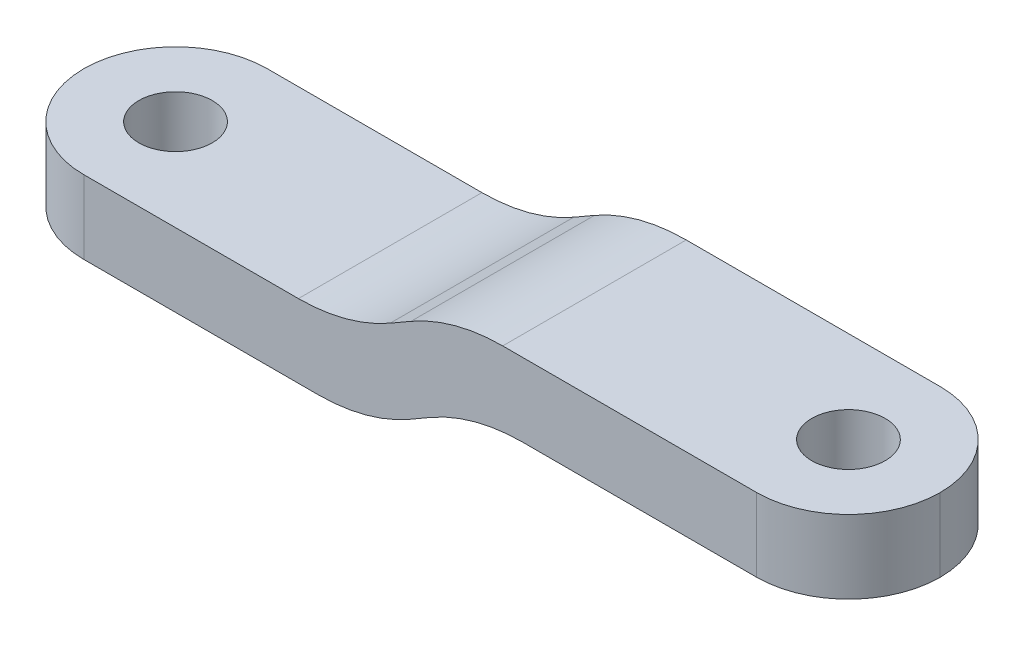
ISO-10303-21;
HEADER;
FILE_DESCRIPTION(('STEP AP214'),'2;1');
FILE_NAME('part.step','',(''),(''),'','','');
FILE_SCHEMA(('AUTOMOTIVE_DESIGN { 1 0 10303 214 1 1 1 1 }'));
ENDSEC;
DATA;
#1=APPLICATION_CONTEXT('core data for automotive mechanical design processes');
#2=APPLICATION_PROTOCOL_DEFINITION('international standard','automotive_design',2000,#1);
#3=PRODUCT_CONTEXT('',#1,'mechanical');
#4=PRODUCT('Part','Part','',(#3));
#5=PRODUCT_RELATED_PRODUCT_CATEGORY('part','',(#4));
#6=PRODUCT_DEFINITION_FORMATION('','',#4);
#7=PRODUCT_DEFINITION_CONTEXT('part definition',#1,'design');
#8=PRODUCT_DEFINITION('design','',#6,#7);
#9=PRODUCT_DEFINITION_SHAPE('','',#8);
#10=(LENGTH_UNIT() NAMED_UNIT(*) SI_UNIT(.MILLI.,.METRE.));
#11=(NAMED_UNIT(*) PLANE_ANGLE_UNIT() SI_UNIT($,.RADIAN.));
#12=(NAMED_UNIT(*) SI_UNIT($,.STERADIAN.) SOLID_ANGLE_UNIT());
#13=UNCERTAINTY_MEASURE_WITH_UNIT(LENGTH_MEASURE(1.E-05),#10,'distance_accuracy_value','');
#14=(GEOMETRIC_REPRESENTATION_CONTEXT(3) GLOBAL_UNCERTAINTY_ASSIGNED_CONTEXT((#13)) GLOBAL_UNIT_ASSIGNED_CONTEXT((#10,
#11,#12)) REPRESENTATION_CONTEXT('',''));
#15=CARTESIAN_POINT('',(0.,0.,0.));
#16=DIRECTION('',(0.,0.,1.));
#17=DIRECTION('',(1.,0.,0.));
#18=AXIS2_PLACEMENT_3D('',#15,#16,#17);
#19=CARTESIAN_POINT('',(0.,0.,7.5));
#20=DIRECTION('',(-0.500000000000001,0.866025403784438,0.));
#21=DIRECTION('',(-0.866025403784438,-0.500000000000001,0.));
#22=AXIS2_PLACEMENT_3D('',#19,#20,#21);
#23=PLANE('',#22);
#24=DIRECTION('',(0.866025403784438,0.500000000000001,0.));
#25=VECTOR('',#24,1.);
#26=CARTESIAN_POINT('',(0.,0.,7.5));
#27=LINE('',#26,#25);
#28=CARTESIAN_POINT('',(3.48076211353317,2.00961894323343,7.5));
#29=VERTEX_POINT('',#28);
#30=CARTESIAN_POINT('',(5.1794919243112,2.99038105676657,7.5));
#31=VERTEX_POINT('',#30);
#32=EDGE_CURVE('E160',#29,#31,#27,.T.);
#33=ORIENTED_EDGE('',*,*,#32,.F.);
#34=DIRECTION('',(0.,0.,-1.));
#35=VECTOR('',#34,1.);
#36=CARTESIAN_POINT('',(3.48076211353317,2.00961894323343,7.5));
#37=LINE('',#36,#35);
#38=CARTESIAN_POINT('',(3.48076211353317,2.00961894323343,-7.5));
#39=VERTEX_POINT('',#38);
#40=EDGE_CURVE('E146',#29,#39,#37,.T.);
#41=ORIENTED_EDGE('',*,*,#40,.T.);
#42=DIRECTION('',(0.866025403784438,0.500000000000001,0.));
#43=VECTOR('',#42,1.);
#44=CARTESIAN_POINT('',(0.,0.,-7.5));
#45=LINE('',#44,#43);
#46=CARTESIAN_POINT('',(5.1794919243112,2.99038105676657,-7.5));
#47=VERTEX_POINT('',#46);
#48=EDGE_CURVE('E157',#39,#47,#45,.T.);
#49=ORIENTED_EDGE('',*,*,#48,.T.);
#50=DIRECTION('',(0.,0.,-1.));
#51=VECTOR('',#50,1.);
#52=CARTESIAN_POINT('',(5.1794919243112,2.99038105676657,7.5));
#53=LINE('',#52,#51);
#54=EDGE_CURVE('E161',#47,#31,#53,.F.);
#55=ORIENTED_EDGE('',*,*,#54,.T.);
#56=EDGE_LOOP('',(#33,#41,#49,#55));
#57=FACE_BOUND('',#56,.T.);
#58=ADVANCED_FACE('F39',(#57),#23,.F.);
#59=CARTESIAN_POINT('',(8.66025403784437,5.,7.5));
#60=DIRECTION('',(0.,1.,0.));
#61=DIRECTION('',(0.,0.,1.));
#62=AXIS2_PLACEMENT_3D('',#59,#60,#61);
#63=PLANE('',#62);
#64=CARTESIAN_POINT('',(31.8301270189222,5.,0.));
#65=DIRECTION('',(0.,1.,0.));
#66=DIRECTION('',(0.,0.,1.));
#67=AXIS2_PLACEMENT_3D('',#64,#65,#66);
#68=CIRCLE('',#67,3.);
#69=CARTESIAN_POINT('',(31.8301270189222,5.,3.));
#70=VERTEX_POINT('',#69);
#71=EDGE_CURVE('E251',#70,#70,#68,.T.);
#72=ORIENTED_EDGE('',*,*,#71,.T.);
#73=EDGE_LOOP('',(#72));
#74=FACE_BOUND('',#73,.T.);
#75=DIRECTION('',(1.,0.,0.));
#76=VECTOR('',#75,1.);
#77=CARTESIAN_POINT('',(8.66025403784437,5.,-7.5));
#78=LINE('',#77,#76);
#79=CARTESIAN_POINT('',(12.6794919243112,5.,-7.5));
#80=VERTEX_POINT('',#79);
#81=CARTESIAN_POINT('',(31.8301270189222,5.,-7.5));
#82=VERTEX_POINT('',#81);
#83=EDGE_CURVE('E166',#80,#82,#78,.T.);
#84=ORIENTED_EDGE('',*,*,#83,.T.);
#85=CARTESIAN_POINT('',(31.8301270189222,5.,0.));
#86=DIRECTION('',(0.,1.,0.));
#87=DIRECTION('',(0.,0.,1.));
#88=AXIS2_PLACEMENT_3D('',#85,#86,#87);
#89=CIRCLE('',#88,7.5);
#90=CARTESIAN_POINT('',(39.3301270189222,5.,0.));
#91=VERTEX_POINT('',#90);
#92=EDGE_CURVE('E11',#82,#91,#89,.F.);
#93=ORIENTED_EDGE('',*,*,#92,.T.);
#94=CARTESIAN_POINT('',(31.8301270189222,5.,0.));
#95=DIRECTION('',(0.,1.,0.));
#96=DIRECTION('',(0.,0.,1.));
#97=AXIS2_PLACEMENT_3D('',#94,#95,#96);
#98=CIRCLE('',#97,7.5);
#99=CARTESIAN_POINT('',(31.8301270189222,5.,7.5));
#100=VERTEX_POINT('',#99);
#101=EDGE_CURVE('E48',#91,#100,#98,.F.);
#102=ORIENTED_EDGE('',*,*,#101,.T.);
#103=DIRECTION('',(1.,0.,0.));
#104=VECTOR('',#103,1.);
#105=CARTESIAN_POINT('',(8.66025403784437,5.,7.5));
#106=LINE('',#105,#104);
#107=CARTESIAN_POINT('',(12.6794919243112,5.,7.5));
#108=VERTEX_POINT('',#107);
#109=EDGE_CURVE('E238',#108,#100,#106,.T.);
#110=ORIENTED_EDGE('',*,*,#109,.F.);
#111=DIRECTION('',(0.,0.,-1.));
#112=VECTOR('',#111,1.);
#113=CARTESIAN_POINT('',(12.6794919243112,5.,-7.5));
#114=LINE('',#113,#112);
#115=EDGE_CURVE('E193',#108,#80,#114,.T.);
#116=ORIENTED_EDGE('',*,*,#115,.T.);
#117=EDGE_LOOP('',(#84,#93,#102,#110,#116));
#118=FACE_BOUND('',#117,.T.);
#119=ADVANCED_FACE('F237',(#74,#118),#63,.F.);
#120=CARTESIAN_POINT('',(7.05255888325765,11.,7.5));
#121=DIRECTION('',(0.,-1.,0.));
#122=DIRECTION('',(0.,0.,-1.));
#123=AXIS2_PLACEMENT_3D('',#120,#121,#122);
#124=PLANE('',#123);
#125=CARTESIAN_POINT('',(31.8301270189222,11.,0.));
#126=DIRECTION('',(0.,1.,0.));
#127=DIRECTION('',(0.,0.,1.));
#128=AXIS2_PLACEMENT_3D('',#125,#126,#127);
#129=CIRCLE('',#128,3.);
#130=CARTESIAN_POINT('',(31.8301270189222,11.,3.));
#131=VERTEX_POINT('',#130);
#132=EDGE_CURVE('E356',#131,#131,#129,.T.);
#133=ORIENTED_EDGE('',*,*,#132,.F.);
#134=EDGE_LOOP('',(#133));
#135=FACE_BOUND('',#134,.T.);
#136=CARTESIAN_POINT('',(31.8301270189222,11.,0.));
#137=DIRECTION('',(0.,-1.,0.));
#138=DIRECTION('',(0.,0.,-1.));
#139=AXIS2_PLACEMENT_3D('',#136,#137,#138);
#140=CIRCLE('',#139,7.5);
#141=CARTESIAN_POINT('',(31.8301270189222,11.,7.5));
#142=VERTEX_POINT('',#141);
#143=CARTESIAN_POINT('',(39.3301270189222,11.,0.));
#144=VERTEX_POINT('',#143);
#145=EDGE_CURVE('E62',#142,#144,#140,.F.);
#146=ORIENTED_EDGE('',*,*,#145,.T.);
#147=CARTESIAN_POINT('',(31.8301270189222,11.,0.));
#148=DIRECTION('',(0.,-1.,0.));
#149=DIRECTION('',(0.,0.,-1.));
#150=AXIS2_PLACEMENT_3D('',#147,#148,#149);
#151=CIRCLE('',#150,7.5);
#152=CARTESIAN_POINT('',(31.8301270189222,11.,-7.5));
#153=VERTEX_POINT('',#152);
#154=EDGE_CURVE('E233',#144,#153,#151,.F.);
#155=ORIENTED_EDGE('',*,*,#154,.T.);
#156=DIRECTION('',(-1.,0.,0.));
#157=VECTOR('',#156,1.);
#158=CARTESIAN_POINT('',(7.05255888325765,11.,-7.5));
#159=LINE('',#158,#157);
#160=CARTESIAN_POINT('',(11.0717967697245,11.,-7.5));
#161=VERTEX_POINT('',#160);
#162=EDGE_CURVE('E169',#153,#161,#159,.T.);
#163=ORIENTED_EDGE('',*,*,#162,.T.);
#164=DIRECTION('',(0.,0.,-1.));
#165=VECTOR('',#164,1.);
#166=CARTESIAN_POINT('',(11.0717967697245,11.,7.5));
#167=LINE('',#166,#165);
#168=CARTESIAN_POINT('',(11.0717967697245,11.,7.5));
#169=VERTEX_POINT('',#168);
#170=EDGE_CURVE('E204',#161,#169,#167,.F.);
#171=ORIENTED_EDGE('',*,*,#170,.T.);
#172=DIRECTION('',(-1.,0.,0.));
#173=VECTOR('',#172,1.);
#174=CARTESIAN_POINT('',(7.05255888325765,11.,7.5));
#175=LINE('',#174,#173);
#176=EDGE_CURVE('E247',#142,#169,#175,.T.);
#177=ORIENTED_EDGE('',*,*,#176,.F.);
#178=EDGE_LOOP('',(#146,#155,#163,#171,#177));
#179=FACE_BOUND('',#178,.T.);
#180=ADVANCED_FACE('F255',(#135,#179),#124,.F.);
#181=CARTESIAN_POINT('',(-1.60769515458674,6.,7.5));
#182=DIRECTION('',(0.5,-0.866025403784439,0.));
#183=DIRECTION('',(0.866025403784439,0.5,0.));
#184=AXIS2_PLACEMENT_3D('',#181,#182,#183);
#185=PLANE('',#184);
#186=DIRECTION('',(-0.866025403784439,-0.5,0.));
#187=VECTOR('',#186,1.);
#188=CARTESIAN_POINT('',(-1.60769515458674,6.,-7.5));
#189=LINE('',#188,#187);
#190=CARTESIAN_POINT('',(3.57179676972448,8.99038105676658,-7.5));
#191=VERTEX_POINT('',#190);
#192=CARTESIAN_POINT('',(1.87306695894642,8.00961894323342,-7.5));
#193=VERTEX_POINT('',#192);
#194=EDGE_CURVE('E177',#191,#193,#189,.T.);
#195=ORIENTED_EDGE('',*,*,#194,.T.);
#196=DIRECTION('',(0.,0.,-1.));
#197=VECTOR('',#196,1.);
#198=CARTESIAN_POINT('',(1.87306695894642,8.00961894323342,7.5));
#199=LINE('',#198,#197);
#200=CARTESIAN_POINT('',(1.87306695894642,8.00961894323342,7.5));
#201=VERTEX_POINT('',#200);
#202=EDGE_CURVE('E202',#193,#201,#199,.F.);
#203=ORIENTED_EDGE('',*,*,#202,.T.);
#204=DIRECTION('',(-0.866025403784439,-0.5,0.));
#205=VECTOR('',#204,1.);
#206=CARTESIAN_POINT('',(-1.60769515458674,6.,7.5));
#207=LINE('',#206,#205);
#208=CARTESIAN_POINT('',(3.57179676972448,8.99038105676658,7.5));
#209=VERTEX_POINT('',#208);
#210=EDGE_CURVE('E262',#209,#201,#207,.T.);
#211=ORIENTED_EDGE('',*,*,#210,.F.);
#212=DIRECTION('',(0.,0.,-1.));
#213=VECTOR('',#212,1.);
#214=CARTESIAN_POINT('',(3.57179676972448,8.99038105676658,7.5));
#215=LINE('',#214,#213);
#216=EDGE_CURVE('E199',#209,#191,#215,.T.);
#217=ORIENTED_EDGE('',*,*,#216,.T.);
#218=EDGE_LOOP('',(#195,#203,#211,#217));
#219=FACE_BOUND('',#218,.T.);
#220=ADVANCED_FACE('F320',(#219),#185,.F.);
#221=CARTESIAN_POINT('',(-1.60769515458674,6.,7.5));
#222=DIRECTION('',(0.,-1.,0.));
#223=DIRECTION('',(0.,0.,-1.));
#224=AXIS2_PLACEMENT_3D('',#221,#222,#223);
#225=PLANE('',#224);
#226=CARTESIAN_POINT('',(-23.1698729810778,6.,0.));
#227=DIRECTION('',(0.,-1.,0.));
#228=DIRECTION('',(0.,0.,-1.));
#229=AXIS2_PLACEMENT_3D('',#226,#227,#228);
#230=CIRCLE('',#229,3.);
#231=CARTESIAN_POINT('',(-23.1698729810778,6.,-3.));
#232=VERTEX_POINT('',#231);
#233=EDGE_CURVE('E352',#232,#232,#230,.T.);
#234=ORIENTED_EDGE('',*,*,#233,.T.);
#235=EDGE_LOOP('',(#234));
#236=FACE_BOUND('',#235,.T.);
#237=DIRECTION('',(-1.,0.,0.));
#238=VECTOR('',#237,1.);
#239=CARTESIAN_POINT('',(-1.60769515458674,6.,-7.5));
#240=LINE('',#239,#238);
#241=CARTESIAN_POINT('',(-5.62693304105358,6.,-7.5));
#242=VERTEX_POINT('',#241);
#243=CARTESIAN_POINT('',(-23.1698729810778,6.,-7.5));
#244=VERTEX_POINT('',#243);
#245=EDGE_CURVE('E180',#242,#244,#240,.T.);
#246=ORIENTED_EDGE('',*,*,#245,.T.);
#247=CARTESIAN_POINT('',(-23.1698729810778,6.,0.));
#248=DIRECTION('',(0.,-1.,0.));
#249=DIRECTION('',(0.,0.,-1.));
#250=AXIS2_PLACEMENT_3D('',#247,#248,#249);
#251=CIRCLE('',#250,7.5);
#252=CARTESIAN_POINT('',(-30.6698729810778,6.,0.));
#253=VERTEX_POINT('',#252);
#254=EDGE_CURVE('E226',#244,#253,#251,.F.);
#255=ORIENTED_EDGE('',*,*,#254,.T.);
#256=CARTESIAN_POINT('',(-23.1698729810778,6.,0.));
#257=DIRECTION('',(0.,-1.,0.));
#258=DIRECTION('',(0.,0.,-1.));
#259=AXIS2_PLACEMENT_3D('',#256,#257,#258);
#260=CIRCLE('',#259,7.5);
#261=CARTESIAN_POINT('',(-23.1698729810778,6.,7.5));
#262=VERTEX_POINT('',#261);
#263=EDGE_CURVE('E224',#253,#262,#260,.F.);
#264=ORIENTED_EDGE('',*,*,#263,.T.);
#265=DIRECTION('',(-1.,0.,0.));
#266=VECTOR('',#265,1.);
#267=CARTESIAN_POINT('',(-1.60769515458674,6.,7.5));
#268=LINE('',#267,#266);
#269=CARTESIAN_POINT('',(-5.62693304105358,6.,7.5));
#270=VERTEX_POINT('',#269);
#271=EDGE_CURVE('E265',#270,#262,#268,.T.);
#272=ORIENTED_EDGE('',*,*,#271,.F.);
#273=DIRECTION('',(0.,0.,-1.));
#274=VECTOR('',#273,1.);
#275=CARTESIAN_POINT('',(-5.62693304105358,6.,-7.5));
#276=LINE('',#275,#274);
#277=EDGE_CURVE('E196',#270,#242,#276,.T.);
#278=ORIENTED_EDGE('',*,*,#277,.T.);
#279=EDGE_LOOP('',(#246,#255,#264,#272,#278));
#280=FACE_BOUND('',#279,.T.);
#281=ADVANCED_FACE('F282',(#236,#280),#225,.F.);
#282=CARTESIAN_POINT('',(0.,0.,7.5));
#283=DIRECTION('',(0.,1.,0.));
#284=DIRECTION('',(0.,0.,1.));
#285=AXIS2_PLACEMENT_3D('',#282,#283,#284);
#286=PLANE('',#285);
#287=CARTESIAN_POINT('',(-23.1698729810778,0.,0.));
#288=DIRECTION('',(0.,1.,0.));
#289=DIRECTION('',(0.,0.,1.));
#290=AXIS2_PLACEMENT_3D('',#287,#288,#289);
#291=CIRCLE('',#290,3.);
#292=CARTESIAN_POINT('',(-23.1698729810778,0.,3.));
#293=VERTEX_POINT('',#292);
#294=EDGE_CURVE('E349',#293,#293,#291,.T.);
#295=ORIENTED_EDGE('',*,*,#294,.T.);
#296=EDGE_LOOP('',(#295));
#297=FACE_BOUND('',#296,.T.);
#298=CARTESIAN_POINT('',(-23.1698729810778,0.,0.));
#299=DIRECTION('',(0.,1.,0.));
#300=DIRECTION('',(0.,0.,1.));
#301=AXIS2_PLACEMENT_3D('',#298,#299,#300);
#302=CIRCLE('',#301,7.5);
#303=CARTESIAN_POINT('',(-23.1698729810778,0.,7.5));
#304=VERTEX_POINT('',#303);
#305=CARTESIAN_POINT('',(-30.6698729810778,0.,0.));
#306=VERTEX_POINT('',#305);
#307=EDGE_CURVE('E214',#304,#306,#302,.F.);
#308=ORIENTED_EDGE('',*,*,#307,.T.);
#309=CARTESIAN_POINT('',(-23.1698729810778,0.,0.));
#310=DIRECTION('',(0.,1.,0.));
#311=DIRECTION('',(0.,0.,1.));
#312=AXIS2_PLACEMENT_3D('',#309,#310,#311);
#313=CIRCLE('',#312,7.5);
#314=CARTESIAN_POINT('',(-23.1698729810778,0.,-7.5));
#315=VERTEX_POINT('',#314);
#316=EDGE_CURVE('E216',#306,#315,#313,.F.);
#317=ORIENTED_EDGE('',*,*,#316,.T.);
#318=DIRECTION('',(1.,0.,0.));
#319=VECTOR('',#318,1.);
#320=CARTESIAN_POINT('',(0.,0.,-7.5));
#321=LINE('',#320,#319);
#322=CARTESIAN_POINT('',(-4.01923788646685,0.,-7.5));
#323=VERTEX_POINT('',#322);
#324=EDGE_CURVE('E183',#315,#323,#321,.T.);
#325=ORIENTED_EDGE('',*,*,#324,.T.);
#326=DIRECTION('',(0.,0.,-1.));
#327=VECTOR('',#326,1.);
#328=CARTESIAN_POINT('',(-4.01923788646685,0.,7.5));
#329=LINE('',#328,#327);
#330=CARTESIAN_POINT('',(-4.01923788646685,0.,7.5));
#331=VERTEX_POINT('',#330);
#332=EDGE_CURVE('E148',#323,#331,#329,.F.);
#333=ORIENTED_EDGE('',*,*,#332,.T.);
#334=DIRECTION('',(1.,0.,0.));
#335=VECTOR('',#334,1.);
#336=CARTESIAN_POINT('',(0.,0.,7.5));
#337=LINE('',#336,#335);
#338=EDGE_CURVE('E173',#304,#331,#337,.T.);
#339=ORIENTED_EDGE('',*,*,#338,.F.);
#340=EDGE_LOOP('',(#308,#317,#325,#333,#339));
#341=FACE_BOUND('',#340,.T.);
#342=ADVANCED_FACE('F273',(#297,#341),#286,.F.);
#343=CARTESIAN_POINT('',(0.,0.,7.5));
#344=DIRECTION('',(0.,0.,1.));
#345=DIRECTION('',(1.,0.,0.));
#346=AXIS2_PLACEMENT_3D('',#343,#344,#345);
#347=PLANE('',#346);
#348=ORIENTED_EDGE('',*,*,#271,.T.);
#349=DIRECTION('',(0.,-1.,0.));
#350=VECTOR('',#349,1.);
#351=CARTESIAN_POINT('',(-23.1698729810778,0.,7.5));
#352=LINE('',#351,#350);
#353=EDGE_CURVE('E230',#262,#304,#352,.T.);
#354=ORIENTED_EDGE('',*,*,#353,.T.);
#355=ORIENTED_EDGE('',*,*,#338,.T.);
#356=CARTESIAN_POINT('',(-4.01923788646685,15.,7.5));
#357=DIRECTION('',(0.,0.,1.));
#358=DIRECTION('',(1.,0.,0.));
#359=AXIS2_PLACEMENT_3D('',#356,#357,#358);
#360=CIRCLE('',#359,15.);
#361=EDGE_CURVE('E191',#331,#29,#360,.T.);
#362=ORIENTED_EDGE('',*,*,#361,.T.);
#363=ORIENTED_EDGE('',*,*,#32,.T.);
#364=CARTESIAN_POINT('',(12.6794919243112,-10.,7.5));
#365=DIRECTION('',(0.,0.,1.));
#366=DIRECTION('',(1.,0.,0.));
#367=AXIS2_PLACEMENT_3D('',#364,#365,#366);
#368=CIRCLE('',#367,15.);
#369=EDGE_CURVE('E208',#31,#108,#368,.F.);
#370=ORIENTED_EDGE('',*,*,#369,.T.);
#371=ORIENTED_EDGE('',*,*,#109,.T.);
#372=DIRECTION('',(0.,1.,0.));
#373=VECTOR('',#372,1.);
#374=CARTESIAN_POINT('',(31.8301270189222,11.,7.5));
#375=LINE('',#374,#373);
#376=EDGE_CURVE('E228',#100,#142,#375,.T.);
#377=ORIENTED_EDGE('',*,*,#376,.T.);
#378=ORIENTED_EDGE('',*,*,#176,.T.);
#379=CARTESIAN_POINT('',(11.0717967697245,-4.,7.5));
#380=DIRECTION('',(0.,0.,1.));
#381=DIRECTION('',(1.,0.,0.));
#382=AXIS2_PLACEMENT_3D('',#379,#380,#381);
#383=CIRCLE('',#382,15.);
#384=EDGE_CURVE('E189',#169,#209,#383,.T.);
#385=ORIENTED_EDGE('',*,*,#384,.T.);
#386=ORIENTED_EDGE('',*,*,#210,.T.);
#387=CARTESIAN_POINT('',(-5.62693304105358,21.,7.5));
#388=DIRECTION('',(0.,0.,1.));
#389=DIRECTION('',(1.,0.,0.));
#390=AXIS2_PLACEMENT_3D('',#387,#388,#389);
#391=CIRCLE('',#390,15.);
#392=EDGE_CURVE('E212',#201,#270,#391,.F.);
#393=ORIENTED_EDGE('',*,*,#392,.T.);
#394=EDGE_LOOP('',(#348,#354,#355,#362,#363,#370,#371,#377,#378,#385,#386,#393));
#395=FACE_BOUND('',#394,.T.);
#396=ADVANCED_FACE('F245',(#395),#347,.T.);
#397=CARTESIAN_POINT('',(0.,0.,-7.5));
#398=DIRECTION('',(0.,0.,1.));
#399=DIRECTION('',(1.,0.,0.));
#400=AXIS2_PLACEMENT_3D('',#397,#398,#399);
#401=PLANE('',#400);
#402=ORIENTED_EDGE('',*,*,#324,.F.);
#403=DIRECTION('',(0.,-1.,0.));
#404=VECTOR('',#403,1.);
#405=CARTESIAN_POINT('',(-23.1698729810778,0.,-7.5));
#406=LINE('',#405,#404);
#407=EDGE_CURVE('E221',#315,#244,#406,.F.);
#408=ORIENTED_EDGE('',*,*,#407,.T.);
#409=ORIENTED_EDGE('',*,*,#245,.F.);
#410=CARTESIAN_POINT('',(-5.62693304105358,21.,-7.5));
#411=DIRECTION('',(0.,0.,1.));
#412=DIRECTION('',(1.,0.,0.));
#413=AXIS2_PLACEMENT_3D('',#410,#411,#412);
#414=CIRCLE('',#413,15.);
#415=EDGE_CURVE('E210',#242,#193,#414,.T.);
#416=ORIENTED_EDGE('',*,*,#415,.T.);
#417=ORIENTED_EDGE('',*,*,#194,.F.);
#418=CARTESIAN_POINT('',(11.0717967697245,-4.,-7.5));
#419=DIRECTION('',(0.,0.,1.));
#420=DIRECTION('',(1.,0.,0.));
#421=AXIS2_PLACEMENT_3D('',#418,#419,#420);
#422=CIRCLE('',#421,15.);
#423=EDGE_CURVE('E152',#191,#161,#422,.F.);
#424=ORIENTED_EDGE('',*,*,#423,.T.);
#425=ORIENTED_EDGE('',*,*,#162,.F.);
#426=DIRECTION('',(0.,1.,0.));
#427=VECTOR('',#426,1.);
#428=CARTESIAN_POINT('',(31.8301270189222,0.,-7.5));
#429=LINE('',#428,#427);
#430=EDGE_CURVE('E218',#153,#82,#429,.F.);
#431=ORIENTED_EDGE('',*,*,#430,.T.);
#432=ORIENTED_EDGE('',*,*,#83,.F.);
#433=CARTESIAN_POINT('',(12.6794919243112,-10.,-7.5));
#434=DIRECTION('',(0.,0.,1.));
#435=DIRECTION('',(1.,0.,0.));
#436=AXIS2_PLACEMENT_3D('',#433,#434,#435);
#437=CIRCLE('',#436,15.);
#438=EDGE_CURVE('E165',#80,#47,#437,.T.);
#439=ORIENTED_EDGE('',*,*,#438,.T.);
#440=ORIENTED_EDGE('',*,*,#48,.F.);
#441=CARTESIAN_POINT('',(-4.01923788646685,15.,-7.5));
#442=DIRECTION('',(0.,0.,1.));
#443=DIRECTION('',(1.,0.,0.));
#444=AXIS2_PLACEMENT_3D('',#441,#442,#443);
#445=CIRCLE('',#444,15.);
#446=EDGE_CURVE('E142',#39,#323,#445,.F.);
#447=ORIENTED_EDGE('',*,*,#446,.T.);
#448=EDGE_LOOP('',(#402,#408,#409,#416,#417,#424,#425,#431,#432,#439,#440,#447));
#449=FACE_BOUND('',#448,.T.);
#450=ADVANCED_FACE('F163',(#449),#401,.F.);
#451=CARTESIAN_POINT('',(-4.01923788646685,15.,7.5));
#452=DIRECTION('',(0.,0.,-1.));
#453=DIRECTION('',(-1.,0.,0.));
#454=AXIS2_PLACEMENT_3D('',#451,#452,#453);
#455=CYLINDRICAL_SURFACE('',#454,15.);
#456=ORIENTED_EDGE('',*,*,#361,.F.);
#457=ORIENTED_EDGE('',*,*,#332,.F.);
#458=ORIENTED_EDGE('',*,*,#446,.F.);
#459=ORIENTED_EDGE('',*,*,#40,.F.);
#460=EDGE_LOOP('',(#456,#457,#458,#459));
#461=FACE_BOUND('',#460,.T.);
#462=ADVANCED_FACE('F145',(#461),#455,.T.);
#463=CARTESIAN_POINT('',(12.6794919243112,-10.,7.5));
#464=DIRECTION('',(0.,0.,1.));
#465=DIRECTION('',(1.,0.,0.));
#466=AXIS2_PLACEMENT_3D('',#463,#464,#465);
#467=CYLINDRICAL_SURFACE('',#466,15.);
#468=ORIENTED_EDGE('',*,*,#369,.F.);
#469=ORIENTED_EDGE('',*,*,#54,.F.);
#470=ORIENTED_EDGE('',*,*,#438,.F.);
#471=ORIENTED_EDGE('',*,*,#115,.F.);
#472=EDGE_LOOP('',(#468,#469,#470,#471));
#473=FACE_BOUND('',#472,.T.);
#474=ADVANCED_FACE('F307',(#473),#467,.F.);
#475=CARTESIAN_POINT('',(-5.62693304105358,21.,7.5));
#476=DIRECTION('',(0.,0.,1.));
#477=DIRECTION('',(1.,0.,0.));
#478=AXIS2_PLACEMENT_3D('',#475,#476,#477);
#479=CYLINDRICAL_SURFACE('',#478,15.);
#480=ORIENTED_EDGE('',*,*,#392,.F.);
#481=ORIENTED_EDGE('',*,*,#202,.F.);
#482=ORIENTED_EDGE('',*,*,#415,.F.);
#483=ORIENTED_EDGE('',*,*,#277,.F.);
#484=EDGE_LOOP('',(#480,#481,#482,#483));
#485=FACE_BOUND('',#484,.T.);
#486=ADVANCED_FACE('F293',(#485),#479,.F.);
#487=CARTESIAN_POINT('',(11.0717967697245,-4.,7.5));
#488=DIRECTION('',(0.,0.,-1.));
#489=DIRECTION('',(-1.,0.,0.));
#490=AXIS2_PLACEMENT_3D('',#487,#488,#489);
#491=CYLINDRICAL_SURFACE('',#490,15.);
#492=ORIENTED_EDGE('',*,*,#384,.F.);
#493=ORIENTED_EDGE('',*,*,#170,.F.);
#494=ORIENTED_EDGE('',*,*,#423,.F.);
#495=ORIENTED_EDGE('',*,*,#216,.F.);
#496=EDGE_LOOP('',(#492,#493,#494,#495));
#497=FACE_BOUND('',#496,.T.);
#498=ADVANCED_FACE('F261',(#497),#491,.T.);
#499=CARTESIAN_POINT('',(-23.1698729810778,0.,0.));
#500=DIRECTION('',(0.,1.,0.));
#501=DIRECTION('',(0.,0.,1.));
#502=AXIS2_PLACEMENT_3D('',#499,#500,#501);
#503=CYLINDRICAL_SURFACE('',#502,7.5);
#504=ORIENTED_EDGE('',*,*,#353,.F.);
#505=ORIENTED_EDGE('',*,*,#263,.F.);
#506=DIRECTION('',(0.,-1.,0.));
#507=VECTOR('',#506,1.);
#508=CARTESIAN_POINT('',(-30.6698729810778,6.,0.));
#509=LINE('',#508,#507);
#510=EDGE_CURVE('E167',#306,#253,#509,.F.);
#511=ORIENTED_EDGE('',*,*,#510,.F.);
#512=ORIENTED_EDGE('',*,*,#307,.F.);
#513=EDGE_LOOP('',(#504,#505,#511,#512));
#514=FACE_BOUND('',#513,.T.);
#515=ADVANCED_FACE('F284',(#514),#503,.T.);
#516=CARTESIAN_POINT('',(-23.1698729810778,0.,0.));
#517=DIRECTION('',(0.,-1.,0.));
#518=DIRECTION('',(0.,0.,-1.));
#519=AXIS2_PLACEMENT_3D('',#516,#517,#518);
#520=CYLINDRICAL_SURFACE('',#519,7.5);
#521=ORIENTED_EDGE('',*,*,#254,.F.);
#522=ORIENTED_EDGE('',*,*,#407,.F.);
#523=ORIENTED_EDGE('',*,*,#316,.F.);
#524=ORIENTED_EDGE('',*,*,#510,.T.);
#525=EDGE_LOOP('',(#521,#522,#523,#524));
#526=FACE_BOUND('',#525,.T.);
#527=ADVANCED_FACE('F278',(#526),#520,.T.);
#528=CARTESIAN_POINT('',(31.8301270189222,0.,0.));
#529=DIRECTION('',(0.,-1.,0.));
#530=DIRECTION('',(0.,0.,-1.));
#531=AXIS2_PLACEMENT_3D('',#528,#529,#530);
#532=CYLINDRICAL_SURFACE('',#531,7.5);
#533=ORIENTED_EDGE('',*,*,#376,.F.);
#534=ORIENTED_EDGE('',*,*,#101,.F.);
#535=DIRECTION('',(0.,1.,0.));
#536=VECTOR('',#535,1.);
#537=CARTESIAN_POINT('',(39.3301270189222,5.,0.));
#538=LINE('',#537,#536);
#539=EDGE_CURVE('E43',#144,#91,#538,.F.);
#540=ORIENTED_EDGE('',*,*,#539,.F.);
#541=ORIENTED_EDGE('',*,*,#145,.F.);
#542=EDGE_LOOP('',(#533,#534,#540,#541));
#543=FACE_BOUND('',#542,.T.);
#544=ADVANCED_FACE('F41',(#543),#532,.T.);
#545=CARTESIAN_POINT('',(31.8301270189222,5.,0.));
#546=DIRECTION('',(0.,1.,0.));
#547=DIRECTION('',(0.,0.,1.));
#548=AXIS2_PLACEMENT_3D('',#545,#546,#547);
#549=CYLINDRICAL_SURFACE('',#548,7.5);
#550=ORIENTED_EDGE('',*,*,#92,.F.);
#551=ORIENTED_EDGE('',*,*,#430,.F.);
#552=ORIENTED_EDGE('',*,*,#154,.F.);
#553=ORIENTED_EDGE('',*,*,#539,.T.);
#554=EDGE_LOOP('',(#550,#551,#552,#553));
#555=FACE_BOUND('',#554,.T.);
#556=ADVANCED_FACE('F253',(#555),#549,.T.);
#557=CARTESIAN_POINT('',(-23.1698729810778,0.,0.));
#558=DIRECTION('',(0.,1.,0.));
#559=DIRECTION('',(0.,0.,1.));
#560=AXIS2_PLACEMENT_3D('',#557,#558,#559);
#561=CYLINDRICAL_SURFACE('',#560,3.);
#562=ORIENTED_EDGE('',*,*,#294,.F.);
#563=EDGE_LOOP('',(#562));
#564=FACE_BOUND('',#563,.T.);
#565=ORIENTED_EDGE('',*,*,#233,.F.);
#566=EDGE_LOOP('',(#565));
#567=FACE_BOUND('',#566,.T.);
#568=ADVANCED_FACE('F339',(#564,#567),#561,.F.);
#569=CARTESIAN_POINT('',(31.8301270189222,0.,0.));
#570=DIRECTION('',(0.,1.,0.));
#571=DIRECTION('',(0.,0.,1.));
#572=AXIS2_PLACEMENT_3D('',#569,#570,#571);
#573=CYLINDRICAL_SURFACE('',#572,3.);
#574=ORIENTED_EDGE('',*,*,#132,.T.);
#575=EDGE_LOOP('',(#574));
#576=FACE_BOUND('',#575,.T.);
#577=ORIENTED_EDGE('',*,*,#71,.F.);
#578=EDGE_LOOP('',(#577));
#579=FACE_BOUND('',#578,.T.);
#580=ADVANCED_FACE('F336',(#576,#579),#573,.F.);
#581=CLOSED_SHELL('',(#58,#119,#180,#220,#281,#342,#396,#450,#462,#474,#486,#498,#515,#527,#544,
#556,#568,#580));
#582=MANIFOLD_SOLID_BREP('B2',#581);
#583=ADVANCED_BREP_SHAPE_REPRESENTATION('',(#18,#582),#14);
#584=SHAPE_DEFINITION_REPRESENTATION(#9,#583);
ENDSEC;
END-ISO-10303-21;
